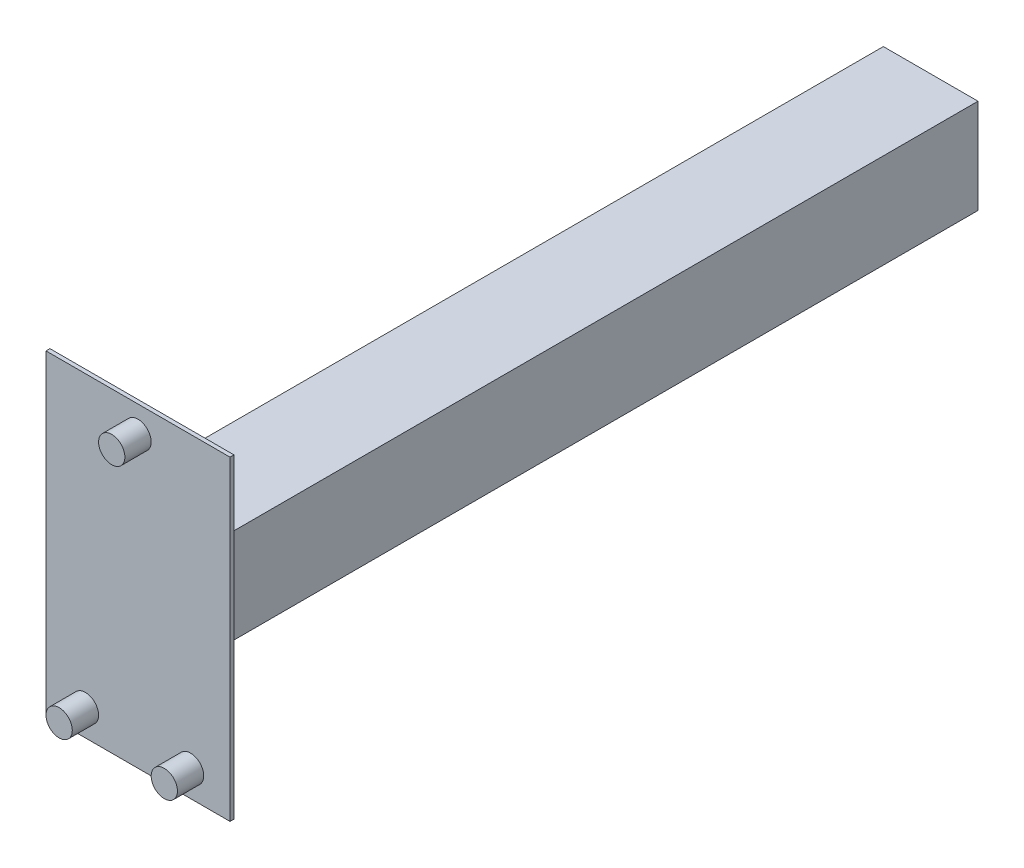
ISO-10303-21;
HEADER;
FILE_DESCRIPTION(('STEP AP214'),'2;1');
FILE_NAME('part.step','',(''),(''),'','','');
FILE_SCHEMA(('AUTOMOTIVE_DESIGN { 1 0 10303 214 1 1 1 1 }'));
ENDSEC;
DATA;
#1=APPLICATION_CONTEXT('core data for automotive mechanical design processes');
#2=APPLICATION_PROTOCOL_DEFINITION('international standard','automotive_design',2000,#1);
#3=PRODUCT_CONTEXT('',#1,'mechanical');
#4=PRODUCT('Part','Part','',(#3));
#5=PRODUCT_RELATED_PRODUCT_CATEGORY('part','',(#4));
#6=PRODUCT_DEFINITION_FORMATION('','',#4);
#7=PRODUCT_DEFINITION_CONTEXT('part definition',#1,'design');
#8=PRODUCT_DEFINITION('design','',#6,#7);
#9=PRODUCT_DEFINITION_SHAPE('','',#8);
#10=(LENGTH_UNIT() NAMED_UNIT(*) SI_UNIT(.MILLI.,.METRE.));
#11=(NAMED_UNIT(*) PLANE_ANGLE_UNIT() SI_UNIT($,.RADIAN.));
#12=(NAMED_UNIT(*) SI_UNIT($,.STERADIAN.) SOLID_ANGLE_UNIT());
#13=UNCERTAINTY_MEASURE_WITH_UNIT(LENGTH_MEASURE(1.E-05),#10,'distance_accuracy_value','');
#14=(GEOMETRIC_REPRESENTATION_CONTEXT(3) GLOBAL_UNCERTAINTY_ASSIGNED_CONTEXT((#13)) GLOBAL_UNIT_ASSIGNED_CONTEXT((#10,
#11,#12)) REPRESENTATION_CONTEXT('',''));
#15=CARTESIAN_POINT('',(0.,0.,0.));
#16=DIRECTION('',(0.,0.,1.));
#17=DIRECTION('',(1.,0.,0.));
#18=AXIS2_PLACEMENT_3D('',#15,#16,#17);
#19=CARTESIAN_POINT('',(18.,-18.,300.));
#20=DIRECTION('',(-1.,0.,0.));
#21=DIRECTION('',(0.,0.,1.));
#22=AXIS2_PLACEMENT_3D('',#19,#20,#21);
#23=PLANE('',#22);
#24=DIRECTION('',(0.,1.,0.));
#25=VECTOR('',#24,1.);
#26=CARTESIAN_POINT('',(18.,-18.,0.));
#27=LINE('',#26,#25);
#28=CARTESIAN_POINT('',(18.,-18.,0.));
#29=VERTEX_POINT('',#28);
#30=CARTESIAN_POINT('',(18.,18.,0.));
#31=VERTEX_POINT('',#30);
#32=EDGE_CURVE('E131',#29,#31,#27,.T.);
#33=ORIENTED_EDGE('',*,*,#32,.T.);
#34=DIRECTION('',(0.,0.,-1.));
#35=VECTOR('',#34,1.);
#36=CARTESIAN_POINT('',(18.,18.,300.));
#37=LINE('',#36,#35);
#38=CARTESIAN_POINT('',(18.,18.,300.));
#39=VERTEX_POINT('',#38);
#40=EDGE_CURVE('E11',#39,#31,#37,.T.);
#41=ORIENTED_EDGE('',*,*,#40,.F.);
#42=DIRECTION('',(0.,1.,0.));
#43=VECTOR('',#42,1.);
#44=CARTESIAN_POINT('',(18.,-18.,300.));
#45=LINE('',#44,#43);
#46=CARTESIAN_POINT('',(18.,-18.,300.));
#47=VERTEX_POINT('',#46);
#48=EDGE_CURVE('E140',#47,#39,#45,.T.);
#49=ORIENTED_EDGE('',*,*,#48,.F.);
#50=DIRECTION('',(0.,0.,-1.));
#51=VECTOR('',#50,1.);
#52=CARTESIAN_POINT('',(18.,-18.,300.));
#53=LINE('',#52,#51);
#54=EDGE_CURVE('E149',#47,#29,#53,.T.);
#55=ORIENTED_EDGE('',*,*,#54,.T.);
#56=EDGE_LOOP('',(#33,#41,#49,#55));
#57=FACE_BOUND('',#56,.T.);
#58=ADVANCED_FACE('F33',(#57),#23,.F.);
#59=CARTESIAN_POINT('',(-18.,18.,300.));
#60=DIRECTION('',(0.,-1.,0.));
#61=DIRECTION('',(0.,0.,-1.));
#62=AXIS2_PLACEMENT_3D('',#59,#60,#61);
#63=PLANE('',#62);
#64=DIRECTION('',(-1.,0.,0.));
#65=VECTOR('',#64,1.);
#66=CARTESIAN_POINT('',(-18.,18.,0.));
#67=LINE('',#66,#65);
#68=CARTESIAN_POINT('',(-18.,18.,0.));
#69=VERTEX_POINT('',#68);
#70=EDGE_CURVE('E134',#31,#69,#67,.T.);
#71=ORIENTED_EDGE('',*,*,#70,.T.);
#72=DIRECTION('',(0.,0.,-1.));
#73=VECTOR('',#72,1.);
#74=CARTESIAN_POINT('',(-18.,18.,300.));
#75=LINE('',#74,#73);
#76=CARTESIAN_POINT('',(-18.,18.,300.));
#77=VERTEX_POINT('',#76);
#78=EDGE_CURVE('E41',#77,#69,#75,.T.);
#79=ORIENTED_EDGE('',*,*,#78,.F.);
#80=DIRECTION('',(-1.,0.,0.));
#81=VECTOR('',#80,1.);
#82=CARTESIAN_POINT('',(-18.,18.,300.));
#83=LINE('',#82,#81);
#84=EDGE_CURVE('E75',#39,#77,#83,.T.);
#85=ORIENTED_EDGE('',*,*,#84,.F.);
#86=ORIENTED_EDGE('',*,*,#40,.T.);
#87=EDGE_LOOP('',(#71,#79,#85,#86));
#88=FACE_BOUND('',#87,.T.);
#89=ADVANCED_FACE('F175',(#88),#63,.F.);
#90=CARTESIAN_POINT('',(-18.,-18.,300.));
#91=DIRECTION('',(1.,0.,0.));
#92=DIRECTION('',(0.,0.,-1.));
#93=AXIS2_PLACEMENT_3D('',#90,#91,#92);
#94=PLANE('',#93);
#95=DIRECTION('',(0.,-1.,0.));
#96=VECTOR('',#95,1.);
#97=CARTESIAN_POINT('',(-18.,-18.,0.));
#98=LINE('',#97,#96);
#99=CARTESIAN_POINT('',(-18.,-18.,0.));
#100=VERTEX_POINT('',#99);
#101=EDGE_CURVE('E65',#69,#100,#98,.T.);
#102=ORIENTED_EDGE('',*,*,#101,.T.);
#103=DIRECTION('',(0.,0.,-1.));
#104=VECTOR('',#103,1.);
#105=CARTESIAN_POINT('',(-18.,-18.,300.));
#106=LINE('',#105,#104);
#107=CARTESIAN_POINT('',(-18.,-18.,300.));
#108=VERTEX_POINT('',#107);
#109=EDGE_CURVE('E49',#108,#100,#106,.T.);
#110=ORIENTED_EDGE('',*,*,#109,.F.);
#111=DIRECTION('',(0.,-1.,0.));
#112=VECTOR('',#111,1.);
#113=CARTESIAN_POINT('',(-18.,-18.,300.));
#114=LINE('',#113,#112);
#115=EDGE_CURVE('E144',#77,#108,#114,.T.);
#116=ORIENTED_EDGE('',*,*,#115,.F.);
#117=ORIENTED_EDGE('',*,*,#78,.T.);
#118=EDGE_LOOP('',(#102,#110,#116,#117));
#119=FACE_BOUND('',#118,.T.);
#120=ADVANCED_FACE('F155',(#119),#94,.F.);
#121=CARTESIAN_POINT('',(-18.,-18.,300.));
#122=DIRECTION('',(0.,1.,0.));
#123=DIRECTION('',(0.,0.,1.));
#124=AXIS2_PLACEMENT_3D('',#121,#122,#123);
#125=PLANE('',#124);
#126=DIRECTION('',(1.,0.,0.));
#127=VECTOR('',#126,1.);
#128=CARTESIAN_POINT('',(-18.,-18.,0.));
#129=LINE('',#128,#127);
#130=EDGE_CURVE('E70',#100,#29,#129,.T.);
#131=ORIENTED_EDGE('',*,*,#130,.T.);
#132=ORIENTED_EDGE('',*,*,#54,.F.);
#133=DIRECTION('',(1.,0.,0.));
#134=VECTOR('',#133,1.);
#135=CARTESIAN_POINT('',(-18.,-18.,300.));
#136=LINE('',#135,#134);
#137=EDGE_CURVE('E147',#108,#47,#136,.T.);
#138=ORIENTED_EDGE('',*,*,#137,.F.);
#139=ORIENTED_EDGE('',*,*,#109,.T.);
#140=EDGE_LOOP('',(#131,#132,#138,#139));
#141=FACE_BOUND('',#140,.T.);
#142=ADVANCED_FACE('F160',(#141),#125,.F.);
#143=CARTESIAN_POINT('',(0.,0.,0.));
#144=DIRECTION('',(0.,0.,-1.));
#145=DIRECTION('',(-1.,0.,0.));
#146=AXIS2_PLACEMENT_3D('',#143,#144,#145);
#147=PLANE('',#146);
#148=ORIENTED_EDGE('',*,*,#32,.F.);
#149=ORIENTED_EDGE('',*,*,#130,.F.);
#150=ORIENTED_EDGE('',*,*,#101,.F.);
#151=ORIENTED_EDGE('',*,*,#70,.F.);
#152=EDGE_LOOP('',(#148,#149,#150,#151));
#153=FACE_BOUND('',#152,.T.);
#154=ADVANCED_FACE('F158',(#153),#147,.T.);
#155=CARTESIAN_POINT('',(0.,0.,300.));
#156=DIRECTION('',(0.,0.,1.));
#157=DIRECTION('',(1.,0.,0.));
#158=AXIS2_PLACEMENT_3D('',#155,#156,#157);
#159=PLANE('',#158);
#160=DIRECTION('',(0.,-1.,0.));
#161=VECTOR('',#160,1.);
#162=CARTESIAN_POINT('',(-35.,60.,300.));
#163=LINE('',#162,#161);
#164=CARTESIAN_POINT('',(-35.,60.,300.));
#165=VERTEX_POINT('',#164);
#166=CARTESIAN_POINT('',(-35.,-60.,300.));
#167=VERTEX_POINT('',#166);
#168=EDGE_CURVE('E130',#165,#167,#163,.T.);
#169=ORIENTED_EDGE('',*,*,#168,.F.);
#170=DIRECTION('',(-1.,0.,0.));
#171=VECTOR('',#170,1.);
#172=CARTESIAN_POINT('',(-35.,60.,300.));
#173=LINE('',#172,#171);
#174=CARTESIAN_POINT('',(35.,60.,300.));
#175=VERTEX_POINT('',#174);
#176=EDGE_CURVE('E126',#175,#165,#173,.T.);
#177=ORIENTED_EDGE('',*,*,#176,.F.);
#178=DIRECTION('',(0.,1.,0.));
#179=VECTOR('',#178,1.);
#180=CARTESIAN_POINT('',(35.,60.,300.));
#181=LINE('',#180,#179);
#182=CARTESIAN_POINT('',(35.,-60.,300.));
#183=VERTEX_POINT('',#182);
#184=EDGE_CURVE('E204',#183,#175,#181,.T.);
#185=ORIENTED_EDGE('',*,*,#184,.F.);
#186=DIRECTION('',(1.,0.,0.));
#187=VECTOR('',#186,1.);
#188=CARTESIAN_POINT('',(-35.,-60.,300.));
#189=LINE('',#188,#187);
#190=EDGE_CURVE('E207',#167,#183,#189,.T.);
#191=ORIENTED_EDGE('',*,*,#190,.F.);
#192=EDGE_LOOP('',(#169,#177,#185,#191));
#193=FACE_BOUND('',#192,.T.);
#194=ORIENTED_EDGE('',*,*,#137,.T.);
#195=ORIENTED_EDGE('',*,*,#48,.T.);
#196=ORIENTED_EDGE('',*,*,#84,.T.);
#197=ORIENTED_EDGE('',*,*,#115,.T.);
#198=EDGE_LOOP('',(#194,#195,#196,#197));
#199=FACE_BOUND('',#198,.T.);
#200=ADVANCED_FACE('F162',(#193,#199),#159,.F.);
#201=CARTESIAN_POINT('',(-35.,60.,301.5));
#202=DIRECTION('',(1.,0.,0.));
#203=DIRECTION('',(0.,1.,0.));
#204=AXIS2_PLACEMENT_3D('',#201,#202,#203);
#205=PLANE('',#204);
#206=ORIENTED_EDGE('',*,*,#168,.T.);
#207=DIRECTION('',(0.,0.,-1.));
#208=VECTOR('',#207,1.);
#209=CARTESIAN_POINT('',(-35.,-60.,301.5));
#210=LINE('',#209,#208);
#211=CARTESIAN_POINT('',(-35.,-60.,301.5));
#212=VERTEX_POINT('',#211);
#213=EDGE_CURVE('E110',#212,#167,#210,.T.);
#214=ORIENTED_EDGE('',*,*,#213,.F.);
#215=DIRECTION('',(0.,-1.,0.));
#216=VECTOR('',#215,1.);
#217=CARTESIAN_POINT('',(-35.,60.,301.5));
#218=LINE('',#217,#216);
#219=CARTESIAN_POINT('',(-35.,60.,301.5));
#220=VERTEX_POINT('',#219);
#221=EDGE_CURVE('E117',#220,#212,#218,.T.);
#222=ORIENTED_EDGE('',*,*,#221,.F.);
#223=DIRECTION('',(0.,0.,-1.));
#224=VECTOR('',#223,1.);
#225=CARTESIAN_POINT('',(-35.,60.,301.5));
#226=LINE('',#225,#224);
#227=EDGE_CURVE('E201',#220,#165,#226,.T.);
#228=ORIENTED_EDGE('',*,*,#227,.T.);
#229=EDGE_LOOP('',(#206,#214,#222,#228));
#230=FACE_BOUND('',#229,.T.);
#231=ADVANCED_FACE('F128',(#230),#205,.F.);
#232=CARTESIAN_POINT('',(-35.,-60.,301.5));
#233=DIRECTION('',(0.,1.,0.));
#234=DIRECTION('',(0.,0.,1.));
#235=AXIS2_PLACEMENT_3D('',#232,#233,#234);
#236=PLANE('',#235);
#237=ORIENTED_EDGE('',*,*,#190,.T.);
#238=DIRECTION('',(0.,0.,-1.));
#239=VECTOR('',#238,1.);
#240=CARTESIAN_POINT('',(35.,-60.,301.5));
#241=LINE('',#240,#239);
#242=CARTESIAN_POINT('',(35.,-60.,301.5));
#243=VERTEX_POINT('',#242);
#244=EDGE_CURVE('E113',#243,#183,#241,.T.);
#245=ORIENTED_EDGE('',*,*,#244,.F.);
#246=DIRECTION('',(1.,0.,0.));
#247=VECTOR('',#246,1.);
#248=CARTESIAN_POINT('',(-35.,-60.,301.5));
#249=LINE('',#248,#247);
#250=EDGE_CURVE('E106',#212,#243,#249,.T.);
#251=ORIENTED_EDGE('',*,*,#250,.F.);
#252=ORIENTED_EDGE('',*,*,#213,.T.);
#253=EDGE_LOOP('',(#237,#245,#251,#252));
#254=FACE_BOUND('',#253,.T.);
#255=ADVANCED_FACE('F108',(#254),#236,.F.);
#256=CARTESIAN_POINT('',(35.,60.,301.5));
#257=DIRECTION('',(-1.,0.,0.));
#258=DIRECTION('',(0.,-1.,0.));
#259=AXIS2_PLACEMENT_3D('',#256,#257,#258);
#260=PLANE('',#259);
#261=ORIENTED_EDGE('',*,*,#184,.T.);
#262=DIRECTION('',(0.,0.,-1.));
#263=VECTOR('',#262,1.);
#264=CARTESIAN_POINT('',(35.,60.,301.5));
#265=LINE('',#264,#263);
#266=CARTESIAN_POINT('',(35.,60.,301.5));
#267=VERTEX_POINT('',#266);
#268=EDGE_CURVE('E136',#267,#175,#265,.T.);
#269=ORIENTED_EDGE('',*,*,#268,.F.);
#270=DIRECTION('',(0.,1.,0.));
#271=VECTOR('',#270,1.);
#272=CARTESIAN_POINT('',(35.,60.,301.5));
#273=LINE('',#272,#271);
#274=EDGE_CURVE('E116',#243,#267,#273,.T.);
#275=ORIENTED_EDGE('',*,*,#274,.F.);
#276=ORIENTED_EDGE('',*,*,#244,.T.);
#277=EDGE_LOOP('',(#261,#269,#275,#276));
#278=FACE_BOUND('',#277,.T.);
#279=ADVANCED_FACE('F188',(#278),#260,.F.);
#280=CARTESIAN_POINT('',(-35.,60.,301.5));
#281=DIRECTION('',(0.,-1.,0.));
#282=DIRECTION('',(0.,0.,-1.));
#283=AXIS2_PLACEMENT_3D('',#280,#281,#282);
#284=PLANE('',#283);
#285=ORIENTED_EDGE('',*,*,#176,.T.);
#286=ORIENTED_EDGE('',*,*,#227,.F.);
#287=DIRECTION('',(-1.,0.,0.));
#288=VECTOR('',#287,1.);
#289=CARTESIAN_POINT('',(-35.,60.,301.5));
#290=LINE('',#289,#288);
#291=EDGE_CURVE('E122',#267,#220,#290,.T.);
#292=ORIENTED_EDGE('',*,*,#291,.F.);
#293=ORIENTED_EDGE('',*,*,#268,.T.);
#294=EDGE_LOOP('',(#285,#286,#292,#293));
#295=FACE_BOUND('',#294,.T.);
#296=ADVANCED_FACE('F190',(#295),#284,.F.);
#297=CARTESIAN_POINT('',(0.,0.,301.5));
#298=DIRECTION('',(0.,0.,1.));
#299=DIRECTION('',(1.,0.,0.));
#300=AXIS2_PLACEMENT_3D('',#297,#298,#299);
#301=PLANE('',#300);
#302=CARTESIAN_POINT('',(20.,-50.,301.5));
#303=DIRECTION('',(0.,0.,1.));
#304=DIRECTION('',(1.,0.,0.));
#305=AXIS2_PLACEMENT_3D('',#302,#303,#304);
#306=CIRCLE('',#305,5.);
#307=CARTESIAN_POINT('',(25.,-50.,301.5));
#308=VERTEX_POINT('',#307);
#309=EDGE_CURVE('E227',#308,#308,#306,.T.);
#310=ORIENTED_EDGE('',*,*,#309,.F.);
#311=EDGE_LOOP('',(#310));
#312=FACE_BOUND('',#311,.T.);
#313=CARTESIAN_POINT('',(-20.,-50.,301.5));
#314=DIRECTION('',(0.,0.,1.));
#315=DIRECTION('',(1.,0.,0.));
#316=AXIS2_PLACEMENT_3D('',#313,#314,#315);
#317=CIRCLE('',#316,5.);
#318=CARTESIAN_POINT('',(-15.,-50.,301.5));
#319=VERTEX_POINT('',#318);
#320=EDGE_CURVE('E221',#319,#319,#317,.T.);
#321=ORIENTED_EDGE('',*,*,#320,.F.);
#322=EDGE_LOOP('',(#321));
#323=FACE_BOUND('',#322,.T.);
#324=CARTESIAN_POINT('',(0.,50.,301.5));
#325=DIRECTION('',(0.,0.,1.));
#326=DIRECTION('',(1.,0.,0.));
#327=AXIS2_PLACEMENT_3D('',#324,#325,#326);
#328=CIRCLE('',#327,5.);
#329=CARTESIAN_POINT('',(5.,50.,301.5));
#330=VERTEX_POINT('',#329);
#331=EDGE_CURVE('E212',#330,#330,#328,.T.);
#332=ORIENTED_EDGE('',*,*,#331,.F.);
#333=EDGE_LOOP('',(#332));
#334=FACE_BOUND('',#333,.T.);
#335=ORIENTED_EDGE('',*,*,#221,.T.);
#336=ORIENTED_EDGE('',*,*,#250,.T.);
#337=ORIENTED_EDGE('',*,*,#274,.T.);
#338=ORIENTED_EDGE('',*,*,#291,.T.);
#339=EDGE_LOOP('',(#335,#336,#337,#338));
#340=FACE_BOUND('',#339,.T.);
#341=ADVANCED_FACE('F120',(#312,#323,#334,#340),#301,.T.);
#342=CARTESIAN_POINT('',(0.,50.,311.5));
#343=DIRECTION('',(0.,0.,-1.));
#344=DIRECTION('',(-1.,0.,0.));
#345=AXIS2_PLACEMENT_3D('',#342,#343,#344);
#346=CYLINDRICAL_SURFACE('',#345,5.);
#347=CARTESIAN_POINT('',(0.,50.,311.5));
#348=DIRECTION('',(0.,0.,1.));
#349=DIRECTION('',(1.,0.,0.));
#350=AXIS2_PLACEMENT_3D('',#347,#348,#349);
#351=CIRCLE('',#350,5.);
#352=CARTESIAN_POINT('',(5.,50.,311.5));
#353=VERTEX_POINT('',#352);
#354=EDGE_CURVE('E208',#353,#353,#351,.T.);
#355=ORIENTED_EDGE('',*,*,#354,.F.);
#356=EDGE_LOOP('',(#355));
#357=FACE_BOUND('',#356,.T.);
#358=ORIENTED_EDGE('',*,*,#331,.T.);
#359=EDGE_LOOP('',(#358));
#360=FACE_BOUND('',#359,.T.);
#361=ADVANCED_FACE('F197',(#357,#360),#346,.T.);
#362=CARTESIAN_POINT('',(0.,50.,311.5));
#363=DIRECTION('',(0.,0.,1.));
#364=DIRECTION('',(1.,0.,0.));
#365=AXIS2_PLACEMENT_3D('',#362,#363,#364);
#366=PLANE('',#365);
#367=ORIENTED_EDGE('',*,*,#354,.T.);
#368=EDGE_LOOP('',(#367));
#369=FACE_BOUND('',#368,.T.);
#370=ADVANCED_FACE('F247',(#369),#366,.T.);
#371=CARTESIAN_POINT('',(-20.,-50.,311.5));
#372=DIRECTION('',(0.,0.,-1.));
#373=DIRECTION('',(-1.,0.,0.));
#374=AXIS2_PLACEMENT_3D('',#371,#372,#373);
#375=CYLINDRICAL_SURFACE('',#374,5.);
#376=CARTESIAN_POINT('',(-20.,-50.,311.5));
#377=DIRECTION('',(0.,0.,1.));
#378=DIRECTION('',(1.,0.,0.));
#379=AXIS2_PLACEMENT_3D('',#376,#377,#378);
#380=CIRCLE('',#379,5.);
#381=CARTESIAN_POINT('',(-15.,-50.,311.5));
#382=VERTEX_POINT('',#381);
#383=EDGE_CURVE('E219',#382,#382,#380,.T.);
#384=ORIENTED_EDGE('',*,*,#383,.F.);
#385=EDGE_LOOP('',(#384));
#386=FACE_BOUND('',#385,.T.);
#387=ORIENTED_EDGE('',*,*,#320,.T.);
#388=EDGE_LOOP('',(#387));
#389=FACE_BOUND('',#388,.T.);
#390=ADVANCED_FACE('F253',(#386,#389),#375,.T.);
#391=CARTESIAN_POINT('',(-20.,-50.,311.5));
#392=DIRECTION('',(0.,0.,1.));
#393=DIRECTION('',(1.,0.,0.));
#394=AXIS2_PLACEMENT_3D('',#391,#392,#393);
#395=PLANE('',#394);
#396=ORIENTED_EDGE('',*,*,#383,.T.);
#397=EDGE_LOOP('',(#396));
#398=FACE_BOUND('',#397,.T.);
#399=ADVANCED_FACE('F238',(#398),#395,.T.);
#400=CARTESIAN_POINT('',(20.,-50.,311.5));
#401=DIRECTION('',(0.,0.,-1.));
#402=DIRECTION('',(-1.,0.,0.));
#403=AXIS2_PLACEMENT_3D('',#400,#401,#402);
#404=CYLINDRICAL_SURFACE('',#403,5.);
#405=CARTESIAN_POINT('',(20.,-50.,311.5));
#406=DIRECTION('',(0.,0.,1.));
#407=DIRECTION('',(1.,0.,0.));
#408=AXIS2_PLACEMENT_3D('',#405,#406,#407);
#409=CIRCLE('',#408,5.);
#410=CARTESIAN_POINT('',(25.,-50.,311.5));
#411=VERTEX_POINT('',#410);
#412=EDGE_CURVE('E224',#411,#411,#409,.T.);
#413=ORIENTED_EDGE('',*,*,#412,.F.);
#414=EDGE_LOOP('',(#413));
#415=FACE_BOUND('',#414,.T.);
#416=ORIENTED_EDGE('',*,*,#309,.T.);
#417=EDGE_LOOP('',(#416));
#418=FACE_BOUND('',#417,.T.);
#419=ADVANCED_FACE('F235',(#415,#418),#404,.T.);
#420=CARTESIAN_POINT('',(20.,-50.,311.5));
#421=DIRECTION('',(0.,0.,1.));
#422=DIRECTION('',(1.,0.,0.));
#423=AXIS2_PLACEMENT_3D('',#420,#421,#422);
#424=PLANE('',#423);
#425=ORIENTED_EDGE('',*,*,#412,.T.);
#426=EDGE_LOOP('',(#425));
#427=FACE_BOUND('',#426,.T.);
#428=ADVANCED_FACE('F233',(#427),#424,.T.);
#429=CLOSED_SHELL('',(#58,#89,#120,#142,#154,#200,#231,#255,#279,#296,#341,#361,#370,#390,#399,
#419,#428));
#430=MANIFOLD_SOLID_BREP('B2',#429);
#431=ADVANCED_BREP_SHAPE_REPRESENTATION('',(#18,#430),#14);
#432=SHAPE_DEFINITION_REPRESENTATION(#9,#431);
ENDSEC;
END-ISO-10303-21;
